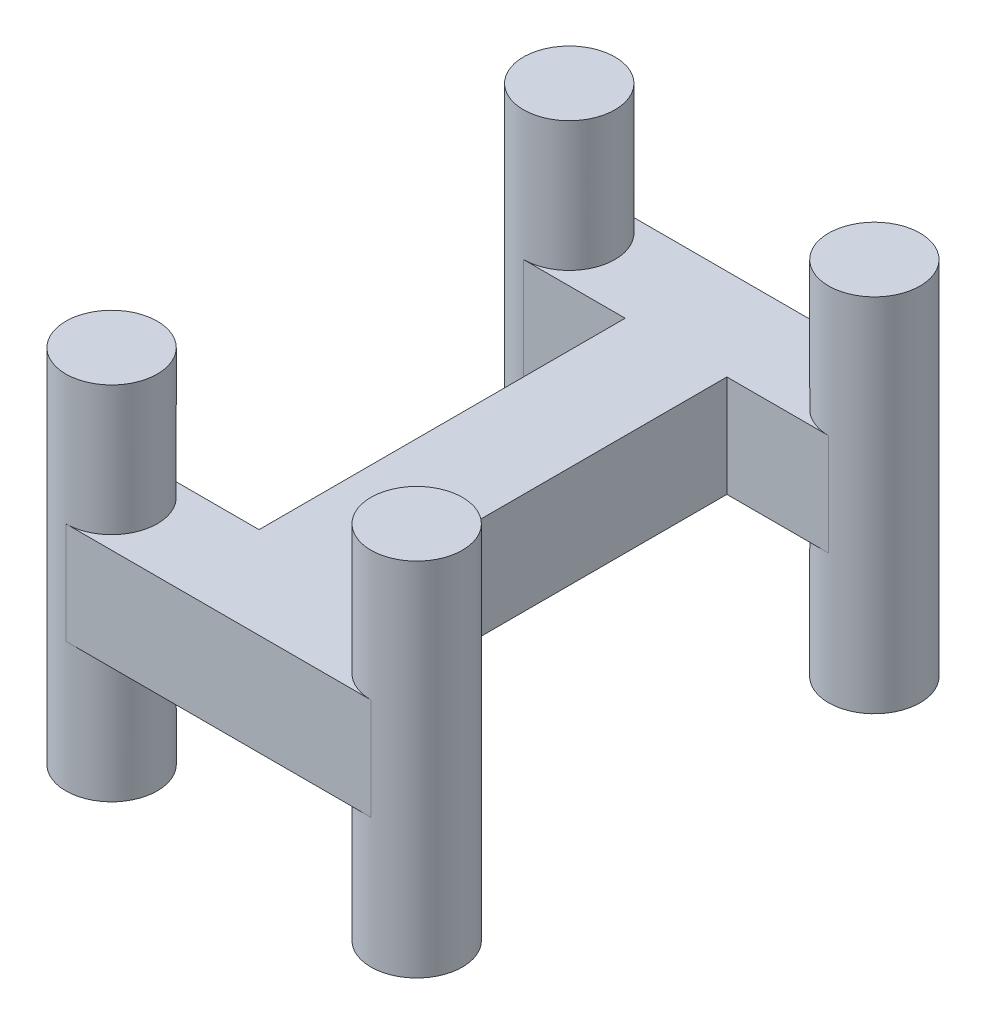
ISO-10303-21;
HEADER;
FILE_DESCRIPTION(('STEP AP214'),'2;1');
FILE_NAME('part.step','',(''),(''),'','','');
FILE_SCHEMA(('AUTOMOTIVE_DESIGN { 1 0 10303 214 1 1 1 1 }'));
ENDSEC;
DATA;
#1=APPLICATION_CONTEXT('core data for automotive mechanical design processes');
#2=APPLICATION_PROTOCOL_DEFINITION('international standard','automotive_design',2000,#1);
#3=PRODUCT_CONTEXT('',#1,'mechanical');
#4=PRODUCT('Part','Part','',(#3));
#5=PRODUCT_RELATED_PRODUCT_CATEGORY('part','',(#4));
#6=PRODUCT_DEFINITION_FORMATION('','',#4);
#7=PRODUCT_DEFINITION_CONTEXT('part definition',#1,'design');
#8=PRODUCT_DEFINITION('design','',#6,#7);
#9=PRODUCT_DEFINITION_SHAPE('','',#8);
#10=(LENGTH_UNIT() NAMED_UNIT(*) SI_UNIT(.MILLI.,.METRE.));
#11=(NAMED_UNIT(*) PLANE_ANGLE_UNIT() SI_UNIT($,.RADIAN.));
#12=(NAMED_UNIT(*) SI_UNIT($,.STERADIAN.) SOLID_ANGLE_UNIT());
#13=UNCERTAINTY_MEASURE_WITH_UNIT(LENGTH_MEASURE(1.E-05),#10,'distance_accuracy_value','');
#14=(GEOMETRIC_REPRESENTATION_CONTEXT(3) GLOBAL_UNCERTAINTY_ASSIGNED_CONTEXT((#13)) GLOBAL_UNIT_ASSIGNED_CONTEXT((#10,
#11,#12)) REPRESENTATION_CONTEXT('',''));
#15=CARTESIAN_POINT('',(0.,0.,0.));
#16=DIRECTION('',(0.,0.,1.));
#17=DIRECTION('',(1.,0.,0.));
#18=AXIS2_PLACEMENT_3D('',#15,#16,#17);
#19=CARTESIAN_POINT('',(0.,-2.,7.2));
#20=DIRECTION('',(0.,0.,-1.));
#21=DIRECTION('',(-1.,0.,0.));
#22=AXIS2_PLACEMENT_3D('',#19,#20,#21);
#23=PLANE('',#22);
#24=DIRECTION('',(0.,1.,0.));
#25=VECTOR('',#24,1.);
#26=CARTESIAN_POINT('',(-6.,-2.,7.2));
#27=LINE('',#26,#25);
#28=CARTESIAN_POINT('',(-6.,-2.,7.2));
#29=VERTEX_POINT('',#28);
#30=CARTESIAN_POINT('',(-6.,2.,7.2));
#31=VERTEX_POINT('',#30);
#32=EDGE_CURVE('E11',#29,#31,#27,.T.);
#33=ORIENTED_EDGE('',*,*,#32,.T.);
#34=DIRECTION('',(-1.,0.,0.));
#35=VECTOR('',#34,1.);
#36=CARTESIAN_POINT('',(0.,2.,7.2));
#37=LINE('',#36,#35);
#38=CARTESIAN_POINT('',(-2.,2.,7.2));
#39=VERTEX_POINT('',#38);
#40=EDGE_CURVE('E189',#39,#31,#37,.T.);
#41=ORIENTED_EDGE('',*,*,#40,.F.);
#42=DIRECTION('',(0.,1.,0.));
#43=VECTOR('',#42,1.);
#44=CARTESIAN_POINT('',(-2.,-2.,7.2));
#45=LINE('',#44,#43);
#46=CARTESIAN_POINT('',(-2.,-2.,7.2));
#47=VERTEX_POINT('',#46);
#48=EDGE_CURVE('E51',#47,#39,#45,.T.);
#49=ORIENTED_EDGE('',*,*,#48,.F.);
#50=DIRECTION('',(-1.,0.,0.));
#51=VECTOR('',#50,1.);
#52=CARTESIAN_POINT('',(0.,-2.,7.2));
#53=LINE('',#52,#51);
#54=EDGE_CURVE('E228',#47,#29,#53,.T.);
#55=ORIENTED_EDGE('',*,*,#54,.T.);
#56=EDGE_LOOP('',(#33,#41,#49,#55));
#57=FACE_BOUND('',#56,.T.);
#58=ADVANCED_FACE('F41',(#57),#23,.T.);
#59=CARTESIAN_POINT('',(-2.,-2.,0.));
#60=DIRECTION('',(-1.,0.,0.));
#61=DIRECTION('',(0.,0.,1.));
#62=AXIS2_PLACEMENT_3D('',#59,#60,#61);
#63=PLANE('',#62);
#64=ORIENTED_EDGE('',*,*,#48,.T.);
#65=DIRECTION('',(0.,0.,1.));
#66=VECTOR('',#65,1.);
#67=CARTESIAN_POINT('',(-2.,2.,0.));
#68=LINE('',#67,#66);
#69=CARTESIAN_POINT('',(-2.,2.,-7.2));
#70=VERTEX_POINT('',#69);
#71=EDGE_CURVE('E185',#70,#39,#68,.T.);
#72=ORIENTED_EDGE('',*,*,#71,.F.);
#73=DIRECTION('',(0.,1.,0.));
#74=VECTOR('',#73,1.);
#75=CARTESIAN_POINT('',(-2.,-2.,-7.2));
#76=LINE('',#75,#74);
#77=CARTESIAN_POINT('',(-2.,-2.,-7.2));
#78=VERTEX_POINT('',#77);
#79=EDGE_CURVE('E233',#78,#70,#76,.T.);
#80=ORIENTED_EDGE('',*,*,#79,.F.);
#81=DIRECTION('',(0.,0.,1.));
#82=VECTOR('',#81,1.);
#83=CARTESIAN_POINT('',(-2.,-2.,0.));
#84=LINE('',#83,#82);
#85=EDGE_CURVE('E225',#78,#47,#84,.T.);
#86=ORIENTED_EDGE('',*,*,#85,.T.);
#87=EDGE_LOOP('',(#64,#72,#80,#86));
#88=FACE_BOUND('',#87,.T.);
#89=ADVANCED_FACE('F293',(#88),#63,.T.);
#90=CARTESIAN_POINT('',(0.,-2.,-7.2));
#91=DIRECTION('',(0.,0.,1.));
#92=DIRECTION('',(1.,0.,0.));
#93=AXIS2_PLACEMENT_3D('',#90,#91,#92);
#94=PLANE('',#93);
#95=ORIENTED_EDGE('',*,*,#79,.T.);
#96=DIRECTION('',(1.,0.,0.));
#97=VECTOR('',#96,1.);
#98=CARTESIAN_POINT('',(0.,2.,-7.2));
#99=LINE('',#98,#97);
#100=CARTESIAN_POINT('',(-6.,2.,-7.2));
#101=VERTEX_POINT('',#100);
#102=EDGE_CURVE('E181',#101,#70,#99,.T.);
#103=ORIENTED_EDGE('',*,*,#102,.F.);
#104=DIRECTION('',(0.,1.,0.));
#105=VECTOR('',#104,1.);
#106=CARTESIAN_POINT('',(-6.,-2.,-7.2));
#107=LINE('',#106,#105);
#108=CARTESIAN_POINT('',(-6.,-2.,-7.2));
#109=VERTEX_POINT('',#108);
#110=EDGE_CURVE('E236',#109,#101,#107,.T.);
#111=ORIENTED_EDGE('',*,*,#110,.F.);
#112=DIRECTION('',(1.,0.,0.));
#113=VECTOR('',#112,1.);
#114=CARTESIAN_POINT('',(0.,-2.,-7.2));
#115=LINE('',#114,#113);
#116=EDGE_CURVE('E221',#109,#78,#115,.T.);
#117=ORIENTED_EDGE('',*,*,#116,.T.);
#118=EDGE_LOOP('',(#95,#103,#111,#117));
#119=FACE_BOUND('',#118,.T.);
#120=ADVANCED_FACE('F290',(#119),#94,.T.);
#121=CARTESIAN_POINT('',(0.,-2.,-10.8));
#122=DIRECTION('',(0.,0.,-1.));
#123=DIRECTION('',(-1.,0.,0.));
#124=AXIS2_PLACEMENT_3D('',#121,#122,#123);
#125=PLANE('',#124);
#126=DIRECTION('',(0.,1.,0.));
#127=VECTOR('',#126,1.);
#128=CARTESIAN_POINT('',(-6.,-2.,-10.8));
#129=LINE('',#128,#127);
#130=CARTESIAN_POINT('',(-6.,-2.,-10.8));
#131=VERTEX_POINT('',#130);
#132=CARTESIAN_POINT('',(-6.,2.,-10.8));
#133=VERTEX_POINT('',#132);
#134=EDGE_CURVE('E240',#131,#133,#129,.T.);
#135=ORIENTED_EDGE('',*,*,#134,.T.);
#136=DIRECTION('',(-1.,0.,0.));
#137=VECTOR('',#136,1.);
#138=CARTESIAN_POINT('',(0.,2.,-10.8));
#139=LINE('',#138,#137);
#140=CARTESIAN_POINT('',(6.,2.,-10.8));
#141=VERTEX_POINT('',#140);
#142=EDGE_CURVE('E174',#141,#133,#139,.T.);
#143=ORIENTED_EDGE('',*,*,#142,.F.);
#144=DIRECTION('',(0.,1.,0.));
#145=VECTOR('',#144,1.);
#146=CARTESIAN_POINT('',(6.,-2.,-10.8));
#147=LINE('',#146,#145);
#148=CARTESIAN_POINT('',(6.,-2.,-10.8));
#149=VERTEX_POINT('',#148);
#150=EDGE_CURVE('E244',#149,#141,#147,.T.);
#151=ORIENTED_EDGE('',*,*,#150,.F.);
#152=DIRECTION('',(-1.,0.,0.));
#153=VECTOR('',#152,1.);
#154=CARTESIAN_POINT('',(0.,-2.,-10.8));
#155=LINE('',#154,#153);
#156=EDGE_CURVE('E214',#149,#131,#155,.T.);
#157=ORIENTED_EDGE('',*,*,#156,.T.);
#158=EDGE_LOOP('',(#135,#143,#151,#157));
#159=FACE_BOUND('',#158,.T.);
#160=ADVANCED_FACE('F284',(#159),#125,.T.);
#161=CARTESIAN_POINT('',(0.,-2.,-7.2));
#162=DIRECTION('',(0.,0.,1.));
#163=DIRECTION('',(1.,0.,0.));
#164=AXIS2_PLACEMENT_3D('',#161,#162,#163);
#165=PLANE('',#164);
#166=DIRECTION('',(0.,1.,0.));
#167=VECTOR('',#166,1.);
#168=CARTESIAN_POINT('',(6.,-2.,-7.2));
#169=LINE('',#168,#167);
#170=CARTESIAN_POINT('',(6.,-2.,-7.2));
#171=VERTEX_POINT('',#170);
#172=CARTESIAN_POINT('',(6.,2.,-7.2));
#173=VERTEX_POINT('',#172);
#174=EDGE_CURVE('E248',#171,#173,#169,.T.);
#175=ORIENTED_EDGE('',*,*,#174,.T.);
#176=DIRECTION('',(1.,0.,0.));
#177=VECTOR('',#176,1.);
#178=CARTESIAN_POINT('',(0.,2.,-7.2));
#179=LINE('',#178,#177);
#180=CARTESIAN_POINT('',(2.,2.,-7.2));
#181=VERTEX_POINT('',#180);
#182=EDGE_CURVE('E167',#181,#173,#179,.T.);
#183=ORIENTED_EDGE('',*,*,#182,.F.);
#184=DIRECTION('',(0.,1.,0.));
#185=VECTOR('',#184,1.);
#186=CARTESIAN_POINT('',(2.,-2.,-7.2));
#187=LINE('',#186,#185);
#188=CARTESIAN_POINT('',(2.,-2.,-7.2));
#189=VERTEX_POINT('',#188);
#190=EDGE_CURVE('E252',#189,#181,#187,.T.);
#191=ORIENTED_EDGE('',*,*,#190,.F.);
#192=DIRECTION('',(1.,0.,0.));
#193=VECTOR('',#192,1.);
#194=CARTESIAN_POINT('',(0.,-2.,-7.2));
#195=LINE('',#194,#193);
#196=EDGE_CURVE('E207',#189,#171,#195,.T.);
#197=ORIENTED_EDGE('',*,*,#196,.T.);
#198=EDGE_LOOP('',(#175,#183,#191,#197));
#199=FACE_BOUND('',#198,.T.);
#200=ADVANCED_FACE('F274',(#199),#165,.T.);
#201=CARTESIAN_POINT('',(2.,-2.,0.));
#202=DIRECTION('',(1.,0.,0.));
#203=DIRECTION('',(0.,0.,-1.));
#204=AXIS2_PLACEMENT_3D('',#201,#202,#203);
#205=PLANE('',#204);
#206=ORIENTED_EDGE('',*,*,#190,.T.);
#207=DIRECTION('',(0.,0.,-1.));
#208=VECTOR('',#207,1.);
#209=CARTESIAN_POINT('',(2.,2.,0.));
#210=LINE('',#209,#208);
#211=CARTESIAN_POINT('',(2.,2.,7.2));
#212=VERTEX_POINT('',#211);
#213=EDGE_CURVE('E160',#212,#181,#210,.T.);
#214=ORIENTED_EDGE('',*,*,#213,.F.);
#215=DIRECTION('',(0.,1.,0.));
#216=VECTOR('',#215,1.);
#217=CARTESIAN_POINT('',(2.,-2.,7.2));
#218=LINE('',#217,#216);
#219=CARTESIAN_POINT('',(2.,-2.,7.2));
#220=VERTEX_POINT('',#219);
#221=EDGE_CURVE('E255',#220,#212,#218,.T.);
#222=ORIENTED_EDGE('',*,*,#221,.F.);
#223=DIRECTION('',(0.,0.,-1.));
#224=VECTOR('',#223,1.);
#225=CARTESIAN_POINT('',(2.,-2.,0.));
#226=LINE('',#225,#224);
#227=EDGE_CURVE('E203',#220,#189,#226,.T.);
#228=ORIENTED_EDGE('',*,*,#227,.T.);
#229=EDGE_LOOP('',(#206,#214,#222,#228));
#230=FACE_BOUND('',#229,.T.);
#231=ADVANCED_FACE('F272',(#230),#205,.T.);
#232=CARTESIAN_POINT('',(0.,-2.,7.2));
#233=DIRECTION('',(0.,0.,-1.));
#234=DIRECTION('',(-1.,0.,0.));
#235=AXIS2_PLACEMENT_3D('',#232,#233,#234);
#236=PLANE('',#235);
#237=ORIENTED_EDGE('',*,*,#221,.T.);
#238=DIRECTION('',(-1.,0.,0.));
#239=VECTOR('',#238,1.);
#240=CARTESIAN_POINT('',(0.,2.,7.2));
#241=LINE('',#240,#239);
#242=CARTESIAN_POINT('',(6.,2.,7.2));
#243=VERTEX_POINT('',#242);
#244=EDGE_CURVE('E157',#243,#212,#241,.T.);
#245=ORIENTED_EDGE('',*,*,#244,.F.);
#246=DIRECTION('',(0.,1.,0.));
#247=VECTOR('',#246,1.);
#248=CARTESIAN_POINT('',(6.,-2.,7.2));
#249=LINE('',#248,#247);
#250=CARTESIAN_POINT('',(6.,-2.,7.2));
#251=VERTEX_POINT('',#250);
#252=EDGE_CURVE('E154',#251,#243,#249,.T.);
#253=ORIENTED_EDGE('',*,*,#252,.F.);
#254=DIRECTION('',(-1.,0.,0.));
#255=VECTOR('',#254,1.);
#256=CARTESIAN_POINT('',(0.,-2.,7.2));
#257=LINE('',#256,#255);
#258=EDGE_CURVE('E199',#251,#220,#257,.T.);
#259=ORIENTED_EDGE('',*,*,#258,.T.);
#260=EDGE_LOOP('',(#237,#245,#253,#259));
#261=FACE_BOUND('',#260,.T.);
#262=ADVANCED_FACE('F268',(#261),#236,.T.);
#263=CARTESIAN_POINT('',(0.,-2.,10.8));
#264=DIRECTION('',(0.,0.,1.));
#265=DIRECTION('',(1.,0.,0.));
#266=AXIS2_PLACEMENT_3D('',#263,#264,#265);
#267=PLANE('',#266);
#268=DIRECTION('',(0.,1.,0.));
#269=VECTOR('',#268,1.);
#270=CARTESIAN_POINT('',(6.,-2.,10.8));
#271=LINE('',#270,#269);
#272=CARTESIAN_POINT('',(6.,-2.,10.8));
#273=VERTEX_POINT('',#272);
#274=CARTESIAN_POINT('',(6.,2.,10.8));
#275=VERTEX_POINT('',#274);
#276=EDGE_CURVE('E149',#273,#275,#271,.T.);
#277=ORIENTED_EDGE('',*,*,#276,.T.);
#278=DIRECTION('',(1.,0.,0.));
#279=VECTOR('',#278,1.);
#280=CARTESIAN_POINT('',(0.,2.,10.8));
#281=LINE('',#280,#279);
#282=CARTESIAN_POINT('',(-6.,2.,10.8));
#283=VERTEX_POINT('',#282);
#284=EDGE_CURVE('E134',#283,#275,#281,.T.);
#285=ORIENTED_EDGE('',*,*,#284,.F.);
#286=DIRECTION('',(0.,1.,0.));
#287=VECTOR('',#286,1.);
#288=CARTESIAN_POINT('',(-6.,-2.,10.8));
#289=LINE('',#288,#287);
#290=CARTESIAN_POINT('',(-6.,-2.,10.8));
#291=VERTEX_POINT('',#290);
#292=EDGE_CURVE('E45',#291,#283,#289,.T.);
#293=ORIENTED_EDGE('',*,*,#292,.F.);
#294=DIRECTION('',(1.,0.,0.));
#295=VECTOR('',#294,1.);
#296=CARTESIAN_POINT('',(0.,-2.,10.8));
#297=LINE('',#296,#295);
#298=EDGE_CURVE('E150',#291,#273,#297,.T.);
#299=ORIENTED_EDGE('',*,*,#298,.T.);
#300=EDGE_LOOP('',(#277,#285,#293,#299));
#301=FACE_BOUND('',#300,.T.);
#302=ADVANCED_FACE('F43',(#301),#267,.T.);
#303=CARTESIAN_POINT('',(0.,-2.,0.));
#304=DIRECTION('',(0.,1.,0.));
#305=DIRECTION('',(0.,0.,1.));
#306=AXIS2_PLACEMENT_3D('',#303,#304,#305);
#307=PLANE('',#306);
#308=CARTESIAN_POINT('',(-6.,-2.,9.));
#309=DIRECTION('',(0.,1.,0.));
#310=DIRECTION('',(0.,0.,1.));
#311=AXIS2_PLACEMENT_3D('',#308,#309,#310);
#312=CIRCLE('',#311,1.8);
#313=EDGE_CURVE('E59',#291,#29,#312,.T.);
#314=ORIENTED_EDGE('',*,*,#313,.T.);
#315=ORIENTED_EDGE('',*,*,#54,.F.);
#316=ORIENTED_EDGE('',*,*,#85,.F.);
#317=ORIENTED_EDGE('',*,*,#116,.F.);
#318=CARTESIAN_POINT('',(-6.,-2.,-9.));
#319=DIRECTION('',(0.,1.,0.));
#320=DIRECTION('',(0.,0.,1.));
#321=AXIS2_PLACEMENT_3D('',#318,#319,#320);
#322=CIRCLE('',#321,1.8);
#323=EDGE_CURVE('E218',#109,#131,#322,.T.);
#324=ORIENTED_EDGE('',*,*,#323,.T.);
#325=ORIENTED_EDGE('',*,*,#156,.F.);
#326=CARTESIAN_POINT('',(6.,-2.,-9.));
#327=DIRECTION('',(0.,1.,0.));
#328=DIRECTION('',(0.,0.,1.));
#329=AXIS2_PLACEMENT_3D('',#326,#327,#328);
#330=CIRCLE('',#329,1.8);
#331=EDGE_CURVE('E211',#149,#171,#330,.T.);
#332=ORIENTED_EDGE('',*,*,#331,.T.);
#333=ORIENTED_EDGE('',*,*,#196,.F.);
#334=ORIENTED_EDGE('',*,*,#227,.F.);
#335=ORIENTED_EDGE('',*,*,#258,.F.);
#336=CARTESIAN_POINT('',(6.,-2.,9.));
#337=DIRECTION('',(0.,1.,0.));
#338=DIRECTION('',(0.,0.,1.));
#339=AXIS2_PLACEMENT_3D('',#336,#337,#338);
#340=CIRCLE('',#339,1.8);
#341=EDGE_CURVE('E196',#251,#273,#340,.T.);
#342=ORIENTED_EDGE('',*,*,#341,.T.);
#343=ORIENTED_EDGE('',*,*,#298,.F.);
#344=EDGE_LOOP('',(#314,#315,#316,#317,#324,#325,#332,#333,#334,#335,#342,#343));
#345=FACE_BOUND('',#344,.T.);
#346=ADVANCED_FACE('F263',(#345),#307,.F.);
#347=CARTESIAN_POINT('',(0.,2.,0.));
#348=DIRECTION('',(0.,1.,0.));
#349=DIRECTION('',(0.,0.,1.));
#350=AXIS2_PLACEMENT_3D('',#347,#348,#349);
#351=PLANE('',#350);
#352=CARTESIAN_POINT('',(-6.,2.,9.));
#353=DIRECTION('',(0.,1.,0.));
#354=DIRECTION('',(0.,0.,1.));
#355=AXIS2_PLACEMENT_3D('',#352,#353,#354);
#356=CIRCLE('',#355,1.8);
#357=EDGE_CURVE('E142',#283,#31,#356,.T.);
#358=ORIENTED_EDGE('',*,*,#357,.F.);
#359=ORIENTED_EDGE('',*,*,#284,.T.);
#360=CARTESIAN_POINT('',(6.,2.,9.));
#361=DIRECTION('',(0.,1.,0.));
#362=DIRECTION('',(0.,0.,1.));
#363=AXIS2_PLACEMENT_3D('',#360,#361,#362);
#364=CIRCLE('',#363,1.8);
#365=EDGE_CURVE('E139',#243,#275,#364,.T.);
#366=ORIENTED_EDGE('',*,*,#365,.F.);
#367=ORIENTED_EDGE('',*,*,#244,.T.);
#368=ORIENTED_EDGE('',*,*,#213,.T.);
#369=ORIENTED_EDGE('',*,*,#182,.T.);
#370=CARTESIAN_POINT('',(6.,2.,-9.));
#371=DIRECTION('',(0.,1.,0.));
#372=DIRECTION('',(0.,0.,1.));
#373=AXIS2_PLACEMENT_3D('',#370,#371,#372);
#374=CIRCLE('',#373,1.8);
#375=EDGE_CURVE('E170',#141,#173,#374,.T.);
#376=ORIENTED_EDGE('',*,*,#375,.F.);
#377=ORIENTED_EDGE('',*,*,#142,.T.);
#378=CARTESIAN_POINT('',(-6.,2.,-9.));
#379=DIRECTION('',(0.,1.,0.));
#380=DIRECTION('',(0.,0.,1.));
#381=AXIS2_PLACEMENT_3D('',#378,#379,#380);
#382=CIRCLE('',#381,1.8);
#383=EDGE_CURVE('E177',#101,#133,#382,.T.);
#384=ORIENTED_EDGE('',*,*,#383,.F.);
#385=ORIENTED_EDGE('',*,*,#102,.T.);
#386=ORIENTED_EDGE('',*,*,#71,.T.);
#387=ORIENTED_EDGE('',*,*,#40,.T.);
#388=EDGE_LOOP('',(#358,#359,#366,#367,#368,#369,#376,#377,#384,#385,#386,#387));
#389=FACE_BOUND('',#388,.T.);
#390=ADVANCED_FACE('F136',(#389),#351,.T.);
#391=CARTESIAN_POINT('',(-6.,-7.1,-9.));
#392=DIRECTION('',(0.,1.,0.));
#393=DIRECTION('',(0.,0.,1.));
#394=AXIS2_PLACEMENT_3D('',#391,#392,#393);
#395=CYLINDRICAL_SURFACE('',#394,1.8);
#396=CARTESIAN_POINT('',(-6.,7.1,-9.));
#397=DIRECTION('',(0.,1.,0.));
#398=DIRECTION('',(0.,0.,1.));
#399=AXIS2_PLACEMENT_3D('',#396,#397,#398);
#400=CIRCLE('',#399,1.8);
#401=CARTESIAN_POINT('',(-6.,7.1,-7.2));
#402=VERTEX_POINT('',#401);
#403=EDGE_CURVE('E395',#402,#402,#400,.T.);
#404=ORIENTED_EDGE('',*,*,#403,.F.);
#405=EDGE_LOOP('',(#404));
#406=FACE_BOUND('',#405,.T.);
#407=CARTESIAN_POINT('',(-6.,-7.1,-9.));
#408=DIRECTION('',(0.,1.,0.));
#409=DIRECTION('',(0.,0.,1.));
#410=AXIS2_PLACEMENT_3D('',#407,#408,#409);
#411=CIRCLE('',#410,1.8);
#412=CARTESIAN_POINT('',(-6.,-7.1,-7.2));
#413=VERTEX_POINT('',#412);
#414=EDGE_CURVE('E399',#413,#413,#411,.T.);
#415=ORIENTED_EDGE('',*,*,#414,.T.);
#416=EDGE_LOOP('',(#415));
#417=FACE_BOUND('',#416,.T.);
#418=ORIENTED_EDGE('',*,*,#323,.F.);
#419=ORIENTED_EDGE('',*,*,#110,.T.);
#420=ORIENTED_EDGE('',*,*,#383,.T.);
#421=ORIENTED_EDGE('',*,*,#134,.F.);
#422=EDGE_LOOP('',(#418,#419,#420,#421));
#423=FACE_BOUND('',#422,.T.);
#424=ADVANCED_FACE('F287',(#406,#417,#423),#395,.T.);
#425=CARTESIAN_POINT('',(0.,-7.1,0.));
#426=DIRECTION('',(0.,1.,0.));
#427=DIRECTION('',(0.,0.,1.));
#428=AXIS2_PLACEMENT_3D('',#425,#426,#427);
#429=PLANE('',#428);
#430=ORIENTED_EDGE('',*,*,#414,.F.);
#431=EDGE_LOOP('',(#430));
#432=FACE_BOUND('',#431,.T.);
#433=ADVANCED_FACE('F324',(#432),#429,.F.);
#434=CARTESIAN_POINT('',(0.,7.1,0.));
#435=DIRECTION('',(0.,1.,0.));
#436=DIRECTION('',(0.,0.,1.));
#437=AXIS2_PLACEMENT_3D('',#434,#435,#436);
#438=PLANE('',#437);
#439=ORIENTED_EDGE('',*,*,#403,.T.);
#440=EDGE_LOOP('',(#439));
#441=FACE_BOUND('',#440,.T.);
#442=ADVANCED_FACE('F330',(#441),#438,.T.);
#443=CARTESIAN_POINT('',(6.,-7.1,-9.));
#444=DIRECTION('',(0.,1.,0.));
#445=DIRECTION('',(0.,0.,1.));
#446=AXIS2_PLACEMENT_3D('',#443,#444,#445);
#447=CYLINDRICAL_SURFACE('',#446,1.8);
#448=CARTESIAN_POINT('',(6.,7.1,-9.));
#449=DIRECTION('',(0.,1.,0.));
#450=DIRECTION('',(0.,0.,1.));
#451=AXIS2_PLACEMENT_3D('',#448,#449,#450);
#452=CIRCLE('',#451,1.8);
#453=CARTESIAN_POINT('',(6.,7.1,-7.2));
#454=VERTEX_POINT('',#453);
#455=EDGE_CURVE('E387',#454,#454,#452,.T.);
#456=ORIENTED_EDGE('',*,*,#455,.F.);
#457=EDGE_LOOP('',(#456));
#458=FACE_BOUND('',#457,.T.);
#459=CARTESIAN_POINT('',(6.,-7.1,-9.));
#460=DIRECTION('',(0.,1.,0.));
#461=DIRECTION('',(0.,0.,1.));
#462=AXIS2_PLACEMENT_3D('',#459,#460,#461);
#463=CIRCLE('',#462,1.8);
#464=CARTESIAN_POINT('',(6.,-7.1,-7.2));
#465=VERTEX_POINT('',#464);
#466=EDGE_CURVE('E391',#465,#465,#463,.T.);
#467=ORIENTED_EDGE('',*,*,#466,.T.);
#468=EDGE_LOOP('',(#467));
#469=FACE_BOUND('',#468,.T.);
#470=ORIENTED_EDGE('',*,*,#331,.F.);
#471=ORIENTED_EDGE('',*,*,#150,.T.);
#472=ORIENTED_EDGE('',*,*,#375,.T.);
#473=ORIENTED_EDGE('',*,*,#174,.F.);
#474=EDGE_LOOP('',(#470,#471,#472,#473));
#475=FACE_BOUND('',#474,.T.);
#476=ADVANCED_FACE('F279',(#458,#469,#475),#447,.T.);
#477=CARTESIAN_POINT('',(0.,-7.1,0.));
#478=DIRECTION('',(0.,1.,0.));
#479=DIRECTION('',(0.,0.,1.));
#480=AXIS2_PLACEMENT_3D('',#477,#478,#479);
#481=PLANE('',#480);
#482=ORIENTED_EDGE('',*,*,#466,.F.);
#483=EDGE_LOOP('',(#482));
#484=FACE_BOUND('',#483,.T.);
#485=ADVANCED_FACE('F337',(#484),#481,.F.);
#486=CARTESIAN_POINT('',(0.,7.1,0.));
#487=DIRECTION('',(0.,1.,0.));
#488=DIRECTION('',(0.,0.,1.));
#489=AXIS2_PLACEMENT_3D('',#486,#487,#488);
#490=PLANE('',#489);
#491=ORIENTED_EDGE('',*,*,#455,.T.);
#492=EDGE_LOOP('',(#491));
#493=FACE_BOUND('',#492,.T.);
#494=ADVANCED_FACE('F341',(#493),#490,.T.);
#495=CARTESIAN_POINT('',(-6.,-7.1,9.));
#496=DIRECTION('',(0.,1.,0.));
#497=DIRECTION('',(0.,0.,1.));
#498=AXIS2_PLACEMENT_3D('',#495,#496,#497);
#499=CYLINDRICAL_SURFACE('',#498,1.8);
#500=CARTESIAN_POINT('',(-6.,7.1,9.));
#501=DIRECTION('',(0.,1.,0.));
#502=DIRECTION('',(0.,0.,1.));
#503=AXIS2_PLACEMENT_3D('',#500,#501,#502);
#504=CIRCLE('',#503,1.8);
#505=CARTESIAN_POINT('',(-6.,7.1,10.8));
#506=VERTEX_POINT('',#505);
#507=EDGE_CURVE('E377',#506,#506,#504,.T.);
#508=ORIENTED_EDGE('',*,*,#507,.F.);
#509=EDGE_LOOP('',(#508));
#510=FACE_BOUND('',#509,.T.);
#511=CARTESIAN_POINT('',(-6.,-7.1,9.));
#512=DIRECTION('',(0.,1.,0.));
#513=DIRECTION('',(0.,0.,1.));
#514=AXIS2_PLACEMENT_3D('',#511,#512,#513);
#515=CIRCLE('',#514,1.8);
#516=CARTESIAN_POINT('',(-6.,-7.1,10.8));
#517=VERTEX_POINT('',#516);
#518=EDGE_CURVE('E383',#517,#517,#515,.T.);
#519=ORIENTED_EDGE('',*,*,#518,.T.);
#520=EDGE_LOOP('',(#519));
#521=FACE_BOUND('',#520,.T.);
#522=ORIENTED_EDGE('',*,*,#313,.F.);
#523=ORIENTED_EDGE('',*,*,#292,.T.);
#524=ORIENTED_EDGE('',*,*,#357,.T.);
#525=ORIENTED_EDGE('',*,*,#32,.F.);
#526=EDGE_LOOP('',(#522,#523,#524,#525));
#527=FACE_BOUND('',#526,.T.);
#528=ADVANCED_FACE('F261',(#510,#521,#527),#499,.T.);
#529=CARTESIAN_POINT('',(0.,-7.1,0.));
#530=DIRECTION('',(0.,1.,0.));
#531=DIRECTION('',(0.,0.,1.));
#532=AXIS2_PLACEMENT_3D('',#529,#530,#531);
#533=PLANE('',#532);
#534=ORIENTED_EDGE('',*,*,#518,.F.);
#535=EDGE_LOOP('',(#534));
#536=FACE_BOUND('',#535,.T.);
#537=ADVANCED_FACE('F348',(#536),#533,.F.);
#538=CARTESIAN_POINT('',(0.,7.1,0.));
#539=DIRECTION('',(0.,1.,0.));
#540=DIRECTION('',(0.,0.,1.));
#541=AXIS2_PLACEMENT_3D('',#538,#539,#540);
#542=PLANE('',#541);
#543=ORIENTED_EDGE('',*,*,#507,.T.);
#544=EDGE_LOOP('',(#543));
#545=FACE_BOUND('',#544,.T.);
#546=ADVANCED_FACE('F352',(#545),#542,.T.);
#547=CARTESIAN_POINT('',(6.,-7.1,9.));
#548=DIRECTION('',(0.,1.,0.));
#549=DIRECTION('',(0.,0.,1.));
#550=AXIS2_PLACEMENT_3D('',#547,#548,#549);
#551=CYLINDRICAL_SURFACE('',#550,1.8);
#552=CARTESIAN_POINT('',(6.,7.1,9.));
#553=DIRECTION('',(0.,1.,0.));
#554=DIRECTION('',(0.,0.,1.));
#555=AXIS2_PLACEMENT_3D('',#552,#553,#554);
#556=CIRCLE('',#555,1.8);
#557=CARTESIAN_POINT('',(6.,7.1,10.8));
#558=VERTEX_POINT('',#557);
#559=EDGE_CURVE('E371',#558,#558,#556,.T.);
#560=ORIENTED_EDGE('',*,*,#559,.F.);
#561=EDGE_LOOP('',(#560));
#562=FACE_BOUND('',#561,.T.);
#563=CARTESIAN_POINT('',(6.,-7.1,9.));
#564=DIRECTION('',(0.,1.,0.));
#565=DIRECTION('',(0.,0.,1.));
#566=AXIS2_PLACEMENT_3D('',#563,#564,#565);
#567=CIRCLE('',#566,1.8);
#568=CARTESIAN_POINT('',(6.,-7.1,10.8));
#569=VERTEX_POINT('',#568);
#570=EDGE_CURVE('E373',#569,#569,#567,.T.);
#571=ORIENTED_EDGE('',*,*,#570,.T.);
#572=EDGE_LOOP('',(#571));
#573=FACE_BOUND('',#572,.T.);
#574=ORIENTED_EDGE('',*,*,#341,.F.);
#575=ORIENTED_EDGE('',*,*,#252,.T.);
#576=ORIENTED_EDGE('',*,*,#365,.T.);
#577=ORIENTED_EDGE('',*,*,#276,.F.);
#578=EDGE_LOOP('',(#574,#575,#576,#577));
#579=FACE_BOUND('',#578,.T.);
#580=ADVANCED_FACE('F155',(#562,#573,#579),#551,.T.);
#581=CARTESIAN_POINT('',(0.,-7.1,0.));
#582=DIRECTION('',(0.,1.,0.));
#583=DIRECTION('',(0.,0.,1.));
#584=AXIS2_PLACEMENT_3D('',#581,#582,#583);
#585=PLANE('',#584);
#586=ORIENTED_EDGE('',*,*,#570,.F.);
#587=EDGE_LOOP('',(#586));
#588=FACE_BOUND('',#587,.T.);
#589=ADVANCED_FACE('F359',(#588),#585,.F.);
#590=CARTESIAN_POINT('',(0.,7.1,0.));
#591=DIRECTION('',(0.,1.,0.));
#592=DIRECTION('',(0.,0.,1.));
#593=AXIS2_PLACEMENT_3D('',#590,#591,#592);
#594=PLANE('',#593);
#595=ORIENTED_EDGE('',*,*,#559,.T.);
#596=EDGE_LOOP('',(#595));
#597=FACE_BOUND('',#596,.T.);
#598=ADVANCED_FACE('F363',(#597),#594,.T.);
#599=CLOSED_SHELL('',(#58,#89,#120,#160,#200,#231,#262,#302,#346,#390,#424,#433,#442,#476,#485,
#494,#528,#537,#546,#580,#589,#598));
#600=MANIFOLD_SOLID_BREP('B2',#599);
#601=ADVANCED_BREP_SHAPE_REPRESENTATION('',(#18,#600),#14);
#602=SHAPE_DEFINITION_REPRESENTATION(#9,#601);
ENDSEC;
END-ISO-10303-21;
